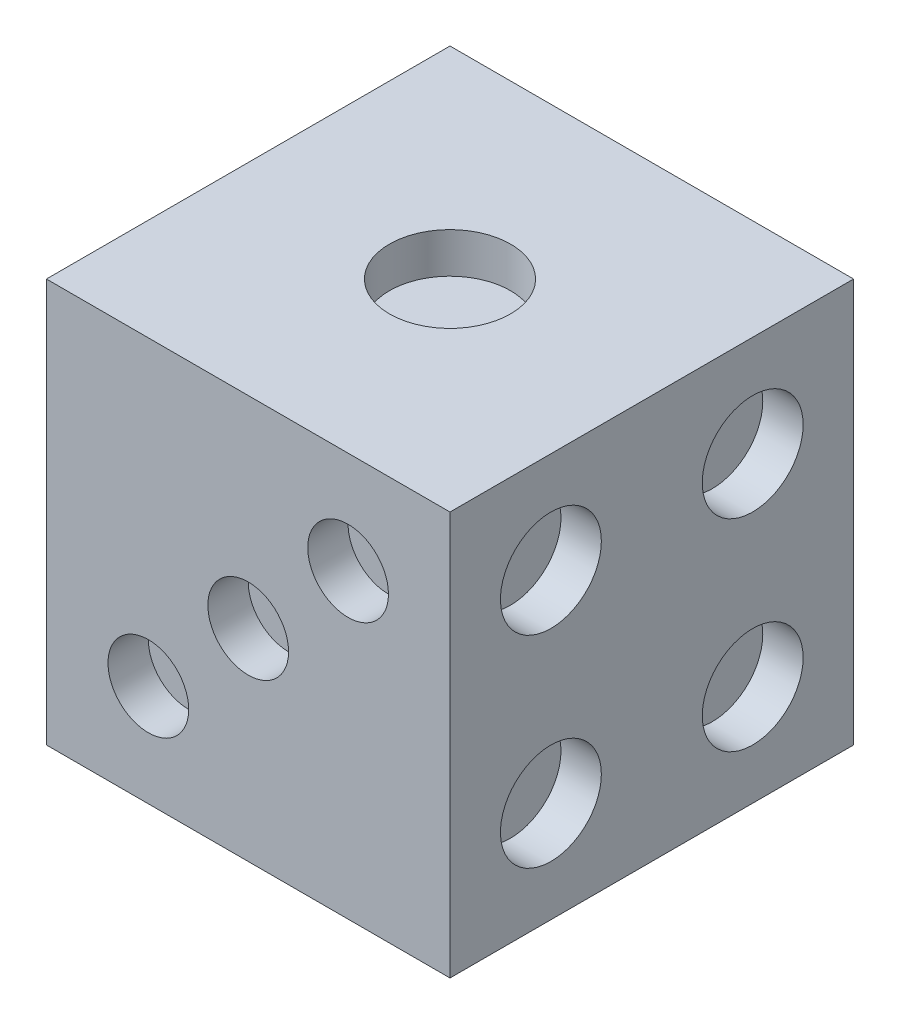
ISO-10303-21;
HEADER;
FILE_DESCRIPTION(('STEP AP214'),'2;1');
FILE_NAME('part.step','',(''),(''),'','','');
FILE_SCHEMA(('AUTOMOTIVE_DESIGN { 1 0 10303 214 1 1 1 1 }'));
ENDSEC;
DATA;
#1=APPLICATION_CONTEXT('core data for automotive mechanical design processes');
#2=APPLICATION_PROTOCOL_DEFINITION('international standard','automotive_design',2000,#1);
#3=PRODUCT_CONTEXT('',#1,'mechanical');
#4=PRODUCT('Part','Part','',(#3));
#5=PRODUCT_RELATED_PRODUCT_CATEGORY('part','',(#4));
#6=PRODUCT_DEFINITION_FORMATION('','',#4);
#7=PRODUCT_DEFINITION_CONTEXT('part definition',#1,'design');
#8=PRODUCT_DEFINITION('design','',#6,#7);
#9=PRODUCT_DEFINITION_SHAPE('','',#8);
#10=(LENGTH_UNIT() NAMED_UNIT(*) SI_UNIT(.MILLI.,.METRE.));
#11=(NAMED_UNIT(*) PLANE_ANGLE_UNIT() SI_UNIT($,.RADIAN.));
#12=(NAMED_UNIT(*) SI_UNIT($,.STERADIAN.) SOLID_ANGLE_UNIT());
#13=UNCERTAINTY_MEASURE_WITH_UNIT(LENGTH_MEASURE(1.E-05),#10,'distance_accuracy_value','');
#14=(GEOMETRIC_REPRESENTATION_CONTEXT(3) GLOBAL_UNCERTAINTY_ASSIGNED_CONTEXT((#13)) GLOBAL_UNIT_ASSIGNED_CONTEXT((#10,
#11,#12)) REPRESENTATION_CONTEXT('',''));
#15=CARTESIAN_POINT('',(0.,0.,0.));
#16=DIRECTION('',(0.,0.,1.));
#17=DIRECTION('',(1.,0.,0.));
#18=AXIS2_PLACEMENT_3D('',#15,#16,#17);
#19=CARTESIAN_POINT('',(50.,100.,50.));
#20=DIRECTION('',(0.,0.,1.));
#21=DIRECTION('',(1.,0.,0.));
#22=AXIS2_PLACEMENT_3D('',#19,#20,#21);
#23=PLANE('',#22);
#24=CARTESIAN_POINT('',(24.7487373415292,74.7487373415292,50.));
#25=DIRECTION('',(0.,0.,1.));
#26=DIRECTION('',(1.,0.,0.));
#27=AXIS2_PLACEMENT_3D('',#24,#25,#26);
#28=CIRCLE('',#27,10.);
#29=CARTESIAN_POINT('',(34.7487373415292,74.7487373415292,50.));
#30=VERTEX_POINT('',#29);
#31=EDGE_CURVE('E124',#30,#30,#28,.T.);
#32=ORIENTED_EDGE('',*,*,#31,.F.);
#33=EDGE_LOOP('',(#32));
#34=FACE_BOUND('',#33,.T.);
#35=CARTESIAN_POINT('',(0.,50.,50.));
#36=DIRECTION('',(0.,0.,1.));
#37=DIRECTION('',(1.,0.,0.));
#38=AXIS2_PLACEMENT_3D('',#35,#36,#37);
#39=CIRCLE('',#38,10.);
#40=CARTESIAN_POINT('',(10.,50.,50.));
#41=VERTEX_POINT('',#40);
#42=EDGE_CURVE('E128',#41,#41,#39,.T.);
#43=ORIENTED_EDGE('',*,*,#42,.F.);
#44=EDGE_LOOP('',(#43));
#45=FACE_BOUND('',#44,.T.);
#46=CARTESIAN_POINT('',(-24.7487373415292,25.2512626584708,50.));
#47=DIRECTION('',(0.,0.,1.));
#48=DIRECTION('',(1.,0.,0.));
#49=AXIS2_PLACEMENT_3D('',#46,#47,#48);
#50=CIRCLE('',#49,10.);
#51=CARTESIAN_POINT('',(-14.7487373415292,25.2512626584708,50.));
#52=VERTEX_POINT('',#51);
#53=EDGE_CURVE('E131',#52,#52,#50,.T.);
#54=ORIENTED_EDGE('',*,*,#53,.F.);
#55=EDGE_LOOP('',(#54));
#56=FACE_BOUND('',#55,.T.);
#57=DIRECTION('',(-1.,0.,0.));
#58=VECTOR('',#57,1.);
#59=CARTESIAN_POINT('',(50.,0.,50.));
#60=LINE('',#59,#58);
#61=CARTESIAN_POINT('',(50.,0.,50.));
#62=VERTEX_POINT('',#61);
#63=CARTESIAN_POINT('',(-50.,0.,50.));
#64=VERTEX_POINT('',#63);
#65=EDGE_CURVE('E103',#62,#64,#60,.T.);
#66=ORIENTED_EDGE('',*,*,#65,.F.);
#67=DIRECTION('',(0.,-1.,0.));
#68=VECTOR('',#67,1.);
#69=CARTESIAN_POINT('',(50.,100.,50.));
#70=LINE('',#69,#68);
#71=CARTESIAN_POINT('',(50.,100.,50.));
#72=VERTEX_POINT('',#71);
#73=EDGE_CURVE('E11',#72,#62,#70,.T.);
#74=ORIENTED_EDGE('',*,*,#73,.F.);
#75=DIRECTION('',(-1.,0.,0.));
#76=VECTOR('',#75,1.);
#77=CARTESIAN_POINT('',(50.,100.,50.));
#78=LINE('',#77,#76);
#79=CARTESIAN_POINT('',(-50.,100.,50.));
#80=VERTEX_POINT('',#79);
#81=EDGE_CURVE('E97',#72,#80,#78,.T.);
#82=ORIENTED_EDGE('',*,*,#81,.T.);
#83=DIRECTION('',(0.,-1.,0.));
#84=VECTOR('',#83,1.);
#85=CARTESIAN_POINT('',(-50.,100.,50.));
#86=LINE('',#85,#84);
#87=EDGE_CURVE('E40',#80,#64,#86,.T.);
#88=ORIENTED_EDGE('',*,*,#87,.T.);
#89=EDGE_LOOP('',(#66,#74,#82,#88));
#90=FACE_BOUND('',#89,.T.);
#91=ADVANCED_FACE('F37',(#34,#45,#56,#90),#23,.T.);
#92=CARTESIAN_POINT('',(50.,100.,50.));
#93=DIRECTION('',(-1.,0.,0.));
#94=DIRECTION('',(0.,0.,1.));
#95=AXIS2_PLACEMENT_3D('',#92,#93,#94);
#96=PLANE('',#95);
#97=CARTESIAN_POINT('',(50.,25.,25.));
#98=DIRECTION('',(1.,0.,0.));
#99=DIRECTION('',(0.,0.,-1.));
#100=AXIS2_PLACEMENT_3D('',#97,#98,#99);
#101=CIRCLE('',#100,12.5);
#102=CARTESIAN_POINT('',(50.,25.,12.5));
#103=VERTEX_POINT('',#102);
#104=EDGE_CURVE('E224',#103,#103,#101,.T.);
#105=ORIENTED_EDGE('',*,*,#104,.F.);
#106=EDGE_LOOP('',(#105));
#107=FACE_BOUND('',#106,.T.);
#108=CARTESIAN_POINT('',(50.,75.,25.));
#109=DIRECTION('',(1.,0.,0.));
#110=DIRECTION('',(0.,0.,-1.));
#111=AXIS2_PLACEMENT_3D('',#108,#109,#110);
#112=CIRCLE('',#111,12.5);
#113=CARTESIAN_POINT('',(50.,75.,12.5));
#114=VERTEX_POINT('',#113);
#115=EDGE_CURVE('E231',#114,#114,#112,.T.);
#116=ORIENTED_EDGE('',*,*,#115,.F.);
#117=EDGE_LOOP('',(#116));
#118=FACE_BOUND('',#117,.T.);
#119=CARTESIAN_POINT('',(50.,75.,-25.));
#120=DIRECTION('',(1.,0.,0.));
#121=DIRECTION('',(0.,0.,-1.));
#122=AXIS2_PLACEMENT_3D('',#119,#120,#121);
#123=CIRCLE('',#122,12.5);
#124=CARTESIAN_POINT('',(50.,75.,-37.5));
#125=VERTEX_POINT('',#124);
#126=EDGE_CURVE('E218',#125,#125,#123,.T.);
#127=ORIENTED_EDGE('',*,*,#126,.F.);
#128=EDGE_LOOP('',(#127));
#129=FACE_BOUND('',#128,.T.);
#130=CARTESIAN_POINT('',(50.,25.,-25.));
#131=DIRECTION('',(1.,0.,0.));
#132=DIRECTION('',(0.,0.,-1.));
#133=AXIS2_PLACEMENT_3D('',#130,#131,#132);
#134=CIRCLE('',#133,12.5);
#135=CARTESIAN_POINT('',(50.,25.,-37.5));
#136=VERTEX_POINT('',#135);
#137=EDGE_CURVE('E215',#136,#136,#134,.T.);
#138=ORIENTED_EDGE('',*,*,#137,.F.);
#139=EDGE_LOOP('',(#138));
#140=FACE_BOUND('',#139,.T.);
#141=DIRECTION('',(0.,0.,-1.));
#142=VECTOR('',#141,1.);
#143=CARTESIAN_POINT('',(50.,0.,50.));
#144=LINE('',#143,#142);
#145=CARTESIAN_POINT('',(50.,0.,-50.));
#146=VERTEX_POINT('',#145);
#147=EDGE_CURVE('E70',#62,#146,#144,.T.);
#148=ORIENTED_EDGE('',*,*,#147,.T.);
#149=DIRECTION('',(0.,-1.,0.));
#150=VECTOR('',#149,1.);
#151=CARTESIAN_POINT('',(50.,100.,-50.));
#152=LINE('',#151,#150);
#153=CARTESIAN_POINT('',(50.,100.,-50.));
#154=VERTEX_POINT('',#153);
#155=EDGE_CURVE('E46',#154,#146,#152,.T.);
#156=ORIENTED_EDGE('',*,*,#155,.F.);
#157=DIRECTION('',(0.,0.,-1.));
#158=VECTOR('',#157,1.);
#159=CARTESIAN_POINT('',(50.,100.,50.));
#160=LINE('',#159,#158);
#161=EDGE_CURVE('E87',#72,#154,#160,.T.);
#162=ORIENTED_EDGE('',*,*,#161,.F.);
#163=ORIENTED_EDGE('',*,*,#73,.T.);
#164=EDGE_LOOP('',(#148,#156,#162,#163));
#165=FACE_BOUND('',#164,.T.);
#166=ADVANCED_FACE('F114',(#107,#118,#129,#140,#165),#96,.F.);
#167=CARTESIAN_POINT('',(50.,100.,-50.));
#168=DIRECTION('',(0.,0.,1.));
#169=DIRECTION('',(1.,0.,0.));
#170=AXIS2_PLACEMENT_3D('',#167,#168,#169);
#171=PLANE('',#170);
#172=CARTESIAN_POINT('',(27.5,22.5,-50.));
#173=DIRECTION('',(0.,0.,-1.));
#174=DIRECTION('',(-1.,0.,0.));
#175=AXIS2_PLACEMENT_3D('',#172,#173,#174);
#176=CIRCLE('',#175,10.);
#177=CARTESIAN_POINT('',(17.5,22.5,-50.));
#178=VERTEX_POINT('',#177);
#179=EDGE_CURVE('E245',#178,#178,#176,.T.);
#180=ORIENTED_EDGE('',*,*,#179,.F.);
#181=EDGE_LOOP('',(#180));
#182=FACE_BOUND('',#181,.T.);
#183=CARTESIAN_POINT('',(-27.5,22.5,-50.));
#184=DIRECTION('',(0.,0.,-1.));
#185=DIRECTION('',(-1.,0.,0.));
#186=AXIS2_PLACEMENT_3D('',#183,#184,#185);
#187=CIRCLE('',#186,10.);
#188=CARTESIAN_POINT('',(-37.5,22.5,-50.));
#189=VERTEX_POINT('',#188);
#190=EDGE_CURVE('E252',#189,#189,#187,.T.);
#191=ORIENTED_EDGE('',*,*,#190,.F.);
#192=EDGE_LOOP('',(#191));
#193=FACE_BOUND('',#192,.T.);
#194=CARTESIAN_POINT('',(-27.5,77.5,-50.));
#195=DIRECTION('',(0.,0.,-1.));
#196=DIRECTION('',(-1.,0.,0.));
#197=AXIS2_PLACEMENT_3D('',#194,#195,#196);
#198=CIRCLE('',#197,10.);
#199=CARTESIAN_POINT('',(-37.5,77.5,-50.));
#200=VERTEX_POINT('',#199);
#201=EDGE_CURVE('E258',#200,#200,#198,.T.);
#202=ORIENTED_EDGE('',*,*,#201,.F.);
#203=EDGE_LOOP('',(#202));
#204=FACE_BOUND('',#203,.T.);
#205=CARTESIAN_POINT('',(27.5,77.5,-50.));
#206=DIRECTION('',(0.,0.,-1.));
#207=DIRECTION('',(-1.,0.,0.));
#208=AXIS2_PLACEMENT_3D('',#205,#206,#207);
#209=CIRCLE('',#208,10.);
#210=CARTESIAN_POINT('',(17.5,77.5,-50.));
#211=VERTEX_POINT('',#210);
#212=EDGE_CURVE('E264',#211,#211,#209,.T.);
#213=ORIENTED_EDGE('',*,*,#212,.F.);
#214=EDGE_LOOP('',(#213));
#215=FACE_BOUND('',#214,.T.);
#216=CARTESIAN_POINT('',(0.,50.,-50.));
#217=DIRECTION('',(0.,0.,-1.));
#218=DIRECTION('',(-1.,0.,0.));
#219=AXIS2_PLACEMENT_3D('',#216,#217,#218);
#220=CIRCLE('',#219,10.);
#221=CARTESIAN_POINT('',(-10.,50.,-50.));
#222=VERTEX_POINT('',#221);
#223=EDGE_CURVE('E239',#222,#222,#220,.T.);
#224=ORIENTED_EDGE('',*,*,#223,.F.);
#225=EDGE_LOOP('',(#224));
#226=FACE_BOUND('',#225,.T.);
#227=DIRECTION('',(-1.,0.,0.));
#228=VECTOR('',#227,1.);
#229=CARTESIAN_POINT('',(50.,0.,-50.));
#230=LINE('',#229,#228);
#231=CARTESIAN_POINT('',(-50.,0.,-50.));
#232=VERTEX_POINT('',#231);
#233=EDGE_CURVE('E94',#146,#232,#230,.T.);
#234=ORIENTED_EDGE('',*,*,#233,.T.);
#235=DIRECTION('',(0.,-1.,0.));
#236=VECTOR('',#235,1.);
#237=CARTESIAN_POINT('',(-50.,100.,-50.));
#238=LINE('',#237,#236);
#239=CARTESIAN_POINT('',(-50.,100.,-50.));
#240=VERTEX_POINT('',#239);
#241=EDGE_CURVE('E91',#240,#232,#238,.T.);
#242=ORIENTED_EDGE('',*,*,#241,.F.);
#243=DIRECTION('',(-1.,0.,0.));
#244=VECTOR('',#243,1.);
#245=CARTESIAN_POINT('',(50.,100.,-50.));
#246=LINE('',#245,#244);
#247=EDGE_CURVE('E82',#154,#240,#246,.T.);
#248=ORIENTED_EDGE('',*,*,#247,.F.);
#249=ORIENTED_EDGE('',*,*,#155,.T.);
#250=EDGE_LOOP('',(#234,#242,#248,#249));
#251=FACE_BOUND('',#250,.T.);
#252=ADVANCED_FACE('F92',(#182,#193,#204,#215,#226,#251),#171,.F.);
#253=CARTESIAN_POINT('',(-50.,100.,50.));
#254=DIRECTION('',(-1.,0.,0.));
#255=DIRECTION('',(0.,0.,1.));
#256=AXIS2_PLACEMENT_3D('',#253,#254,#255);
#257=PLANE('',#256);
#258=CARTESIAN_POINT('',(-50.,33.0294372515229,16.9705627484771));
#259=DIRECTION('',(-1.,0.,0.));
#260=DIRECTION('',(0.,0.,1.));
#261=AXIS2_PLACEMENT_3D('',#258,#259,#260);
#262=CIRCLE('',#261,13.);
#263=CARTESIAN_POINT('',(-50.,33.0294372515229,29.9705627484771));
#264=VERTEX_POINT('',#263);
#265=EDGE_CURVE('E204',#264,#264,#262,.T.);
#266=ORIENTED_EDGE('',*,*,#265,.F.);
#267=EDGE_LOOP('',(#266));
#268=FACE_BOUND('',#267,.T.);
#269=CARTESIAN_POINT('',(-50.,66.9705627484771,-16.9705627484771));
#270=DIRECTION('',(-1.,0.,0.));
#271=DIRECTION('',(0.,0.,1.));
#272=AXIS2_PLACEMENT_3D('',#269,#270,#271);
#273=CIRCLE('',#272,13.);
#274=CARTESIAN_POINT('',(-50.,66.9705627484771,-3.97056274847713));
#275=VERTEX_POINT('',#274);
#276=EDGE_CURVE('E207',#275,#275,#273,.T.);
#277=ORIENTED_EDGE('',*,*,#276,.F.);
#278=EDGE_LOOP('',(#277));
#279=FACE_BOUND('',#278,.T.);
#280=DIRECTION('',(0.,0.,-1.));
#281=VECTOR('',#280,1.);
#282=CARTESIAN_POINT('',(-50.,0.,50.));
#283=LINE('',#282,#281);
#284=EDGE_CURVE('E106',#64,#232,#283,.T.);
#285=ORIENTED_EDGE('',*,*,#284,.F.);
#286=ORIENTED_EDGE('',*,*,#87,.F.);
#287=DIRECTION('',(0.,0.,-1.));
#288=VECTOR('',#287,1.);
#289=CARTESIAN_POINT('',(-50.,100.,50.));
#290=LINE('',#289,#288);
#291=EDGE_CURVE('E86',#80,#240,#290,.T.);
#292=ORIENTED_EDGE('',*,*,#291,.T.);
#293=ORIENTED_EDGE('',*,*,#241,.T.);
#294=EDGE_LOOP('',(#285,#286,#292,#293));
#295=FACE_BOUND('',#294,.T.);
#296=ADVANCED_FACE('F96',(#268,#279,#295),#257,.T.);
#297=CARTESIAN_POINT('',(0.,100.,0.));
#298=DIRECTION('',(0.,-1.,0.));
#299=DIRECTION('',(0.,0.,-1.));
#300=AXIS2_PLACEMENT_3D('',#297,#298,#299);
#301=PLANE('',#300);
#302=CARTESIAN_POINT('',(0.,100.,0.));
#303=DIRECTION('',(0.,1.,0.));
#304=DIRECTION('',(0.,0.,1.));
#305=AXIS2_PLACEMENT_3D('',#302,#303,#304);
#306=CIRCLE('',#305,15.);
#307=CARTESIAN_POINT('',(0.,100.,15.));
#308=VERTEX_POINT('',#307);
#309=EDGE_CURVE('E144',#308,#308,#306,.T.);
#310=ORIENTED_EDGE('',*,*,#309,.F.);
#311=EDGE_LOOP('',(#310));
#312=FACE_BOUND('',#311,.T.);
#313=ORIENTED_EDGE('',*,*,#81,.F.);
#314=ORIENTED_EDGE('',*,*,#161,.T.);
#315=ORIENTED_EDGE('',*,*,#247,.T.);
#316=ORIENTED_EDGE('',*,*,#291,.F.);
#317=EDGE_LOOP('',(#313,#314,#315,#316));
#318=FACE_BOUND('',#317,.T.);
#319=ADVANCED_FACE('F85',(#312,#318),#301,.F.);
#320=CARTESIAN_POINT('',(0.,0.,0.));
#321=DIRECTION('',(0.,-1.,0.));
#322=DIRECTION('',(0.,0.,-1.));
#323=AXIS2_PLACEMENT_3D('',#320,#321,#322);
#324=PLANE('',#323);
#325=CARTESIAN_POINT('',(-16.67,0.,0.));
#326=DIRECTION('',(0.,-1.,0.));
#327=DIRECTION('',(0.,0.,-1.));
#328=AXIS2_PLACEMENT_3D('',#325,#326,#327);
#329=CIRCLE('',#328,10.);
#330=CARTESIAN_POINT('',(-16.67,0.,-10.));
#331=VERTEX_POINT('',#330);
#332=EDGE_CURVE('E294',#331,#331,#329,.T.);
#333=ORIENTED_EDGE('',*,*,#332,.F.);
#334=EDGE_LOOP('',(#333));
#335=FACE_BOUND('',#334,.T.);
#336=CARTESIAN_POINT('',(-16.67,0.,-25.));
#337=DIRECTION('',(0.,-1.,0.));
#338=DIRECTION('',(0.,0.,-1.));
#339=AXIS2_PLACEMENT_3D('',#336,#337,#338);
#340=CIRCLE('',#339,10.);
#341=CARTESIAN_POINT('',(-16.67,0.,-35.));
#342=VERTEX_POINT('',#341);
#343=EDGE_CURVE('E288',#342,#342,#340,.T.);
#344=ORIENTED_EDGE('',*,*,#343,.F.);
#345=EDGE_LOOP('',(#344));
#346=FACE_BOUND('',#345,.T.);
#347=CARTESIAN_POINT('',(16.67,0.,-25.));
#348=DIRECTION('',(0.,-1.,0.));
#349=DIRECTION('',(0.,0.,-1.));
#350=AXIS2_PLACEMENT_3D('',#347,#348,#349);
#351=CIRCLE('',#350,10.);
#352=CARTESIAN_POINT('',(16.67,0.,-35.));
#353=VERTEX_POINT('',#352);
#354=EDGE_CURVE('E282',#353,#353,#351,.T.);
#355=ORIENTED_EDGE('',*,*,#354,.F.);
#356=EDGE_LOOP('',(#355));
#357=FACE_BOUND('',#356,.T.);
#358=CARTESIAN_POINT('',(16.67,0.,25.));
#359=DIRECTION('',(0.,-1.,0.));
#360=DIRECTION('',(0.,0.,-1.));
#361=AXIS2_PLACEMENT_3D('',#358,#359,#360);
#362=CIRCLE('',#361,10.);
#363=CARTESIAN_POINT('',(16.67,0.,15.));
#364=VERTEX_POINT('',#363);
#365=EDGE_CURVE('E275',#364,#364,#362,.T.);
#366=ORIENTED_EDGE('',*,*,#365,.F.);
#367=EDGE_LOOP('',(#366));
#368=FACE_BOUND('',#367,.T.);
#369=CARTESIAN_POINT('',(-16.67,0.,25.));
#370=DIRECTION('',(0.,-1.,0.));
#371=DIRECTION('',(0.,0.,-1.));
#372=AXIS2_PLACEMENT_3D('',#369,#370,#371);
#373=CIRCLE('',#372,10.);
#374=CARTESIAN_POINT('',(-16.67,0.,15.));
#375=VERTEX_POINT('',#374);
#376=EDGE_CURVE('E299',#375,#375,#373,.T.);
#377=ORIENTED_EDGE('',*,*,#376,.F.);
#378=EDGE_LOOP('',(#377));
#379=FACE_BOUND('',#378,.T.);
#380=CARTESIAN_POINT('',(16.67,0.,0.));
#381=DIRECTION('',(0.,-1.,0.));
#382=DIRECTION('',(0.,0.,-1.));
#383=AXIS2_PLACEMENT_3D('',#380,#381,#382);
#384=CIRCLE('',#383,10.);
#385=CARTESIAN_POINT('',(16.67,0.,-10.));
#386=VERTEX_POINT('',#385);
#387=EDGE_CURVE('E269',#386,#386,#384,.T.);
#388=ORIENTED_EDGE('',*,*,#387,.F.);
#389=EDGE_LOOP('',(#388));
#390=FACE_BOUND('',#389,.T.);
#391=ORIENTED_EDGE('',*,*,#65,.T.);
#392=ORIENTED_EDGE('',*,*,#284,.T.);
#393=ORIENTED_EDGE('',*,*,#233,.F.);
#394=ORIENTED_EDGE('',*,*,#147,.F.);
#395=EDGE_LOOP('',(#391,#392,#393,#394));
#396=FACE_BOUND('',#395,.T.);
#397=ADVANCED_FACE('F112',(#335,#346,#357,#368,#379,#390,#396),#324,.T.);
#398=CARTESIAN_POINT('',(0.,90.,0.));
#399=DIRECTION('',(0.,1.,0.));
#400=DIRECTION('',(0.,0.,1.));
#401=AXIS2_PLACEMENT_3D('',#398,#399,#400);
#402=CYLINDRICAL_SURFACE('',#401,15.);
#403=CARTESIAN_POINT('',(0.,90.,0.));
#404=DIRECTION('',(0.,1.,0.));
#405=DIRECTION('',(0.,0.,1.));
#406=AXIS2_PLACEMENT_3D('',#403,#404,#405);
#407=CIRCLE('',#406,15.);
#408=CARTESIAN_POINT('',(0.,90.,15.));
#409=VERTEX_POINT('',#408);
#410=EDGE_CURVE('E107',#409,#409,#407,.T.);
#411=ORIENTED_EDGE('',*,*,#410,.F.);
#412=EDGE_LOOP('',(#411));
#413=FACE_BOUND('',#412,.T.);
#414=ORIENTED_EDGE('',*,*,#309,.T.);
#415=EDGE_LOOP('',(#414));
#416=FACE_BOUND('',#415,.T.);
#417=ADVANCED_FACE('F184',(#413,#416),#402,.F.);
#418=CARTESIAN_POINT('',(0.,90.,0.));
#419=DIRECTION('',(0.,1.,0.));
#420=DIRECTION('',(0.,0.,1.));
#421=AXIS2_PLACEMENT_3D('',#418,#419,#420);
#422=PLANE('',#421);
#423=ORIENTED_EDGE('',*,*,#410,.T.);
#424=EDGE_LOOP('',(#423));
#425=FACE_BOUND('',#424,.T.);
#426=ADVANCED_FACE('F179',(#425),#422,.T.);
#427=CARTESIAN_POINT('',(-24.7487373415292,25.2512626584708,40.));
#428=DIRECTION('',(0.,0.,1.));
#429=DIRECTION('',(1.,0.,0.));
#430=AXIS2_PLACEMENT_3D('',#427,#428,#429);
#431=CYLINDRICAL_SURFACE('',#430,10.);
#432=CARTESIAN_POINT('',(-24.7487373415292,25.2512626584708,40.));
#433=DIRECTION('',(0.,0.,1.));
#434=DIRECTION('',(1.,0.,0.));
#435=AXIS2_PLACEMENT_3D('',#432,#433,#434);
#436=CIRCLE('',#435,10.);
#437=CARTESIAN_POINT('',(-14.7487373415292,25.2512626584708,40.));
#438=VERTEX_POINT('',#437);
#439=EDGE_CURVE('E134',#438,#438,#436,.T.);
#440=ORIENTED_EDGE('',*,*,#439,.F.);
#441=EDGE_LOOP('',(#440));
#442=FACE_BOUND('',#441,.T.);
#443=ORIENTED_EDGE('',*,*,#53,.T.);
#444=EDGE_LOOP('',(#443));
#445=FACE_BOUND('',#444,.T.);
#446=ADVANCED_FACE('F171',(#442,#445),#431,.F.);
#447=CARTESIAN_POINT('',(-24.7487373415292,25.2512626584708,40.));
#448=DIRECTION('',(0.,0.,1.));
#449=DIRECTION('',(1.,0.,0.));
#450=AXIS2_PLACEMENT_3D('',#447,#448,#449);
#451=PLANE('',#450);
#452=ORIENTED_EDGE('',*,*,#439,.T.);
#453=EDGE_LOOP('',(#452));
#454=FACE_BOUND('',#453,.T.);
#455=ADVANCED_FACE('F161',(#454),#451,.T.);
#456=CARTESIAN_POINT('',(0.,50.,40.));
#457=DIRECTION('',(0.,0.,1.));
#458=DIRECTION('',(1.,0.,0.));
#459=AXIS2_PLACEMENT_3D('',#456,#457,#458);
#460=CYLINDRICAL_SURFACE('',#459,10.);
#461=CARTESIAN_POINT('',(0.,50.,40.));
#462=DIRECTION('',(0.,0.,1.));
#463=DIRECTION('',(1.,0.,0.));
#464=AXIS2_PLACEMENT_3D('',#461,#462,#463);
#465=CIRCLE('',#464,10.);
#466=CARTESIAN_POINT('',(10.,50.,40.));
#467=VERTEX_POINT('',#466);
#468=EDGE_CURVE('E133',#467,#467,#465,.T.);
#469=ORIENTED_EDGE('',*,*,#468,.F.);
#470=EDGE_LOOP('',(#469));
#471=FACE_BOUND('',#470,.T.);
#472=ORIENTED_EDGE('',*,*,#42,.T.);
#473=EDGE_LOOP('',(#472));
#474=FACE_BOUND('',#473,.T.);
#475=ADVANCED_FACE('F158',(#471,#474),#460,.F.);
#476=CARTESIAN_POINT('',(0.,50.,40.));
#477=DIRECTION('',(0.,0.,1.));
#478=DIRECTION('',(1.,0.,0.));
#479=AXIS2_PLACEMENT_3D('',#476,#477,#478);
#480=PLANE('',#479);
#481=ORIENTED_EDGE('',*,*,#468,.T.);
#482=EDGE_LOOP('',(#481));
#483=FACE_BOUND('',#482,.T.);
#484=ADVANCED_FACE('F160',(#483),#480,.T.);
#485=CARTESIAN_POINT('',(24.7487373415292,74.7487373415292,40.));
#486=DIRECTION('',(0.,0.,1.));
#487=DIRECTION('',(1.,0.,0.));
#488=AXIS2_PLACEMENT_3D('',#485,#486,#487);
#489=CYLINDRICAL_SURFACE('',#488,10.);
#490=CARTESIAN_POINT('',(24.7487373415292,74.7487373415292,40.));
#491=DIRECTION('',(0.,0.,1.));
#492=DIRECTION('',(1.,0.,0.));
#493=AXIS2_PLACEMENT_3D('',#490,#491,#492);
#494=CIRCLE('',#493,10.);
#495=CARTESIAN_POINT('',(34.7487373415292,74.7487373415292,40.));
#496=VERTEX_POINT('',#495);
#497=EDGE_CURVE('E146',#496,#496,#494,.T.);
#498=ORIENTED_EDGE('',*,*,#497,.F.);
#499=EDGE_LOOP('',(#498));
#500=FACE_BOUND('',#499,.T.);
#501=ORIENTED_EDGE('',*,*,#31,.T.);
#502=EDGE_LOOP('',(#501));
#503=FACE_BOUND('',#502,.T.);
#504=ADVANCED_FACE('F168',(#500,#503),#489,.F.);
#505=CARTESIAN_POINT('',(24.7487373415292,74.7487373415292,40.));
#506=DIRECTION('',(0.,0.,1.));
#507=DIRECTION('',(1.,0.,0.));
#508=AXIS2_PLACEMENT_3D('',#505,#506,#507);
#509=PLANE('',#508);
#510=ORIENTED_EDGE('',*,*,#497,.T.);
#511=EDGE_LOOP('',(#510));
#512=FACE_BOUND('',#511,.T.);
#513=ADVANCED_FACE('F413',(#512),#509,.T.);
#514=CARTESIAN_POINT('',(-40.,66.9705627484771,-16.9705627484771));
#515=DIRECTION('',(-1.,0.,0.));
#516=DIRECTION('',(0.,0.,1.));
#517=AXIS2_PLACEMENT_3D('',#514,#515,#516);
#518=CYLINDRICAL_SURFACE('',#517,13.);
#519=CARTESIAN_POINT('',(-40.,66.9705627484771,-16.9705627484771));
#520=DIRECTION('',(-1.,0.,0.));
#521=DIRECTION('',(0.,0.,1.));
#522=AXIS2_PLACEMENT_3D('',#519,#520,#521);
#523=CIRCLE('',#522,13.);
#524=CARTESIAN_POINT('',(-40.,66.9705627484771,-3.97056274847713));
#525=VERTEX_POINT('',#524);
#526=EDGE_CURVE('E155',#525,#525,#523,.T.);
#527=ORIENTED_EDGE('',*,*,#526,.F.);
#528=EDGE_LOOP('',(#527));
#529=FACE_BOUND('',#528,.T.);
#530=ORIENTED_EDGE('',*,*,#276,.T.);
#531=EDGE_LOOP('',(#530));
#532=FACE_BOUND('',#531,.T.);
#533=ADVANCED_FACE('F410',(#529,#532),#518,.F.);
#534=CARTESIAN_POINT('',(-40.,66.9705627484771,-16.9705627484771));
#535=DIRECTION('',(-1.,0.,0.));
#536=DIRECTION('',(0.,0.,1.));
#537=AXIS2_PLACEMENT_3D('',#534,#535,#536);
#538=PLANE('',#537);
#539=ORIENTED_EDGE('',*,*,#526,.T.);
#540=EDGE_LOOP('',(#539));
#541=FACE_BOUND('',#540,.T.);
#542=ADVANCED_FACE('F408',(#541),#538,.T.);
#543=CARTESIAN_POINT('',(-40.,33.0294372515229,16.9705627484771));
#544=DIRECTION('',(-1.,0.,0.));
#545=DIRECTION('',(0.,0.,1.));
#546=AXIS2_PLACEMENT_3D('',#543,#544,#545);
#547=CYLINDRICAL_SURFACE('',#546,13.);
#548=CARTESIAN_POINT('',(-40.,33.0294372515229,16.9705627484771));
#549=DIRECTION('',(-1.,0.,0.));
#550=DIRECTION('',(0.,0.,1.));
#551=AXIS2_PLACEMENT_3D('',#548,#549,#550);
#552=CIRCLE('',#551,13.);
#553=CARTESIAN_POINT('',(-40.,33.0294372515229,29.9705627484771));
#554=VERTEX_POINT('',#553);
#555=EDGE_CURVE('E139',#554,#554,#552,.T.);
#556=ORIENTED_EDGE('',*,*,#555,.F.);
#557=EDGE_LOOP('',(#556));
#558=FACE_BOUND('',#557,.T.);
#559=ORIENTED_EDGE('',*,*,#265,.T.);
#560=EDGE_LOOP('',(#559));
#561=FACE_BOUND('',#560,.T.);
#562=ADVANCED_FACE('F404',(#558,#561),#547,.F.);
#563=CARTESIAN_POINT('',(-40.,33.0294372515229,16.9705627484771));
#564=DIRECTION('',(-1.,0.,0.));
#565=DIRECTION('',(0.,0.,1.));
#566=AXIS2_PLACEMENT_3D('',#563,#564,#565);
#567=PLANE('',#566);
#568=ORIENTED_EDGE('',*,*,#555,.T.);
#569=EDGE_LOOP('',(#568));
#570=FACE_BOUND('',#569,.T.);
#571=ADVANCED_FACE('F400',(#570),#567,.T.);
#572=CARTESIAN_POINT('',(40.,25.,-25.));
#573=DIRECTION('',(1.,0.,0.));
#574=DIRECTION('',(0.,0.,-1.));
#575=AXIS2_PLACEMENT_3D('',#572,#573,#574);
#576=CYLINDRICAL_SURFACE('',#575,12.5);
#577=CARTESIAN_POINT('',(40.,25.,-25.));
#578=DIRECTION('',(1.,0.,0.));
#579=DIRECTION('',(0.,0.,-1.));
#580=AXIS2_PLACEMENT_3D('',#577,#578,#579);
#581=CIRCLE('',#580,12.5);
#582=CARTESIAN_POINT('',(40.,25.,-37.5));
#583=VERTEX_POINT('',#582);
#584=EDGE_CURVE('E211',#583,#583,#581,.T.);
#585=ORIENTED_EDGE('',*,*,#584,.F.);
#586=EDGE_LOOP('',(#585));
#587=FACE_BOUND('',#586,.T.);
#588=ORIENTED_EDGE('',*,*,#137,.T.);
#589=EDGE_LOOP('',(#588));
#590=FACE_BOUND('',#589,.T.);
#591=ADVANCED_FACE('F396',(#587,#590),#576,.F.);
#592=CARTESIAN_POINT('',(40.,25.,-25.));
#593=DIRECTION('',(1.,0.,0.));
#594=DIRECTION('',(0.,0.,-1.));
#595=AXIS2_PLACEMENT_3D('',#592,#593,#594);
#596=PLANE('',#595);
#597=ORIENTED_EDGE('',*,*,#584,.T.);
#598=EDGE_LOOP('',(#597));
#599=FACE_BOUND('',#598,.T.);
#600=ADVANCED_FACE('F374',(#599),#596,.T.);
#601=CARTESIAN_POINT('',(40.,75.,-25.));
#602=DIRECTION('',(1.,0.,0.));
#603=DIRECTION('',(0.,0.,-1.));
#604=AXIS2_PLACEMENT_3D('',#601,#602,#603);
#605=CYLINDRICAL_SURFACE('',#604,12.5);
#606=CARTESIAN_POINT('',(40.,75.,-25.));
#607=DIRECTION('',(1.,0.,0.));
#608=DIRECTION('',(0.,0.,-1.));
#609=AXIS2_PLACEMENT_3D('',#606,#607,#608);
#610=CIRCLE('',#609,12.5);
#611=CARTESIAN_POINT('',(40.,75.,-37.5));
#612=VERTEX_POINT('',#611);
#613=EDGE_CURVE('E234',#612,#612,#610,.T.);
#614=ORIENTED_EDGE('',*,*,#613,.F.);
#615=EDGE_LOOP('',(#614));
#616=FACE_BOUND('',#615,.T.);
#617=ORIENTED_EDGE('',*,*,#126,.T.);
#618=EDGE_LOOP('',(#617));
#619=FACE_BOUND('',#618,.T.);
#620=ADVANCED_FACE('F370',(#616,#619),#605,.F.);
#621=CARTESIAN_POINT('',(40.,75.,-25.));
#622=DIRECTION('',(1.,0.,0.));
#623=DIRECTION('',(0.,0.,-1.));
#624=AXIS2_PLACEMENT_3D('',#621,#622,#623);
#625=PLANE('',#624);
#626=ORIENTED_EDGE('',*,*,#613,.T.);
#627=EDGE_LOOP('',(#626));
#628=FACE_BOUND('',#627,.T.);
#629=ADVANCED_FACE('F373',(#628),#625,.T.);
#630=CARTESIAN_POINT('',(40.,75.,25.));
#631=DIRECTION('',(1.,0.,0.));
#632=DIRECTION('',(0.,0.,-1.));
#633=AXIS2_PLACEMENT_3D('',#630,#631,#632);
#634=CYLINDRICAL_SURFACE('',#633,12.5);
#635=CARTESIAN_POINT('',(40.,75.,25.));
#636=DIRECTION('',(1.,0.,0.));
#637=DIRECTION('',(0.,0.,-1.));
#638=AXIS2_PLACEMENT_3D('',#635,#636,#637);
#639=CIRCLE('',#638,12.5);
#640=CARTESIAN_POINT('',(40.,75.,12.5));
#641=VERTEX_POINT('',#640);
#642=EDGE_CURVE('E228',#641,#641,#639,.T.);
#643=ORIENTED_EDGE('',*,*,#642,.F.);
#644=EDGE_LOOP('',(#643));
#645=FACE_BOUND('',#644,.T.);
#646=ORIENTED_EDGE('',*,*,#115,.T.);
#647=EDGE_LOOP('',(#646));
#648=FACE_BOUND('',#647,.T.);
#649=ADVANCED_FACE('F378',(#645,#648),#634,.F.);
#650=CARTESIAN_POINT('',(40.,75.,25.));
#651=DIRECTION('',(1.,0.,0.));
#652=DIRECTION('',(0.,0.,-1.));
#653=AXIS2_PLACEMENT_3D('',#650,#651,#652);
#654=PLANE('',#653);
#655=ORIENTED_EDGE('',*,*,#642,.T.);
#656=EDGE_LOOP('',(#655));
#657=FACE_BOUND('',#656,.T.);
#658=ADVANCED_FACE('F382',(#657),#654,.T.);
#659=CARTESIAN_POINT('',(40.,25.,25.));
#660=DIRECTION('',(1.,0.,0.));
#661=DIRECTION('',(0.,0.,-1.));
#662=AXIS2_PLACEMENT_3D('',#659,#660,#661);
#663=CYLINDRICAL_SURFACE('',#662,12.5);
#664=CARTESIAN_POINT('',(40.,25.,25.));
#665=DIRECTION('',(1.,0.,0.));
#666=DIRECTION('',(0.,0.,-1.));
#667=AXIS2_PLACEMENT_3D('',#664,#665,#666);
#668=CIRCLE('',#667,12.5);
#669=CARTESIAN_POINT('',(40.,25.,12.5));
#670=VERTEX_POINT('',#669);
#671=EDGE_CURVE('E221',#670,#670,#668,.T.);
#672=ORIENTED_EDGE('',*,*,#671,.F.);
#673=EDGE_LOOP('',(#672));
#674=FACE_BOUND('',#673,.T.);
#675=ORIENTED_EDGE('',*,*,#104,.T.);
#676=EDGE_LOOP('',(#675));
#677=FACE_BOUND('',#676,.T.);
#678=ADVANCED_FACE('F386',(#674,#677),#663,.F.);
#679=CARTESIAN_POINT('',(40.,25.,25.));
#680=DIRECTION('',(1.,0.,0.));
#681=DIRECTION('',(0.,0.,-1.));
#682=AXIS2_PLACEMENT_3D('',#679,#680,#681);
#683=PLANE('',#682);
#684=ORIENTED_EDGE('',*,*,#671,.T.);
#685=EDGE_LOOP('',(#684));
#686=FACE_BOUND('',#685,.T.);
#687=ADVANCED_FACE('F368',(#686),#683,.T.);
#688=CARTESIAN_POINT('',(0.,50.,-40.));
#689=DIRECTION('',(0.,0.,-1.));
#690=DIRECTION('',(-1.,0.,0.));
#691=AXIS2_PLACEMENT_3D('',#688,#689,#690);
#692=CYLINDRICAL_SURFACE('',#691,10.);
#693=CARTESIAN_POINT('',(0.,50.,-40.));
#694=DIRECTION('',(0.,0.,-1.));
#695=DIRECTION('',(-1.,0.,0.));
#696=AXIS2_PLACEMENT_3D('',#693,#694,#695);
#697=CIRCLE('',#696,10.);
#698=CARTESIAN_POINT('',(-10.,50.,-40.));
#699=VERTEX_POINT('',#698);
#700=EDGE_CURVE('E225',#699,#699,#697,.T.);
#701=ORIENTED_EDGE('',*,*,#700,.F.);
#702=EDGE_LOOP('',(#701));
#703=FACE_BOUND('',#702,.T.);
#704=ORIENTED_EDGE('',*,*,#223,.T.);
#705=EDGE_LOOP('',(#704));
#706=FACE_BOUND('',#705,.T.);
#707=ADVANCED_FACE('F364',(#703,#706),#692,.F.);
#708=CARTESIAN_POINT('',(0.,50.,-40.));
#709=DIRECTION('',(0.,0.,-1.));
#710=DIRECTION('',(-1.,0.,0.));
#711=AXIS2_PLACEMENT_3D('',#708,#709,#710);
#712=PLANE('',#711);
#713=ORIENTED_EDGE('',*,*,#700,.T.);
#714=EDGE_LOOP('',(#713));
#715=FACE_BOUND('',#714,.T.);
#716=ADVANCED_FACE('F342',(#715),#712,.T.);
#717=CARTESIAN_POINT('',(27.5,77.5,-40.));
#718=DIRECTION('',(0.,0.,-1.));
#719=DIRECTION('',(-1.,0.,0.));
#720=AXIS2_PLACEMENT_3D('',#717,#718,#719);
#721=CYLINDRICAL_SURFACE('',#720,10.);
#722=CARTESIAN_POINT('',(27.5,77.5,-40.));
#723=DIRECTION('',(0.,0.,-1.));
#724=DIRECTION('',(-1.,0.,0.));
#725=AXIS2_PLACEMENT_3D('',#722,#723,#724);
#726=CIRCLE('',#725,10.);
#727=CARTESIAN_POINT('',(17.5,77.5,-40.));
#728=VERTEX_POINT('',#727);
#729=EDGE_CURVE('E242',#728,#728,#726,.T.);
#730=ORIENTED_EDGE('',*,*,#729,.F.);
#731=EDGE_LOOP('',(#730));
#732=FACE_BOUND('',#731,.T.);
#733=ORIENTED_EDGE('',*,*,#212,.T.);
#734=EDGE_LOOP('',(#733));
#735=FACE_BOUND('',#734,.T.);
#736=ADVANCED_FACE('F338',(#732,#735),#721,.F.);
#737=CARTESIAN_POINT('',(27.5,77.5,-40.));
#738=DIRECTION('',(0.,0.,-1.));
#739=DIRECTION('',(-1.,0.,0.));
#740=AXIS2_PLACEMENT_3D('',#737,#738,#739);
#741=PLANE('',#740);
#742=ORIENTED_EDGE('',*,*,#729,.T.);
#743=EDGE_LOOP('',(#742));
#744=FACE_BOUND('',#743,.T.);
#745=ADVANCED_FACE('F334',(#744),#741,.T.);
#746=CARTESIAN_POINT('',(-27.5,77.5,-40.));
#747=DIRECTION('',(0.,0.,-1.));
#748=DIRECTION('',(-1.,0.,0.));
#749=AXIS2_PLACEMENT_3D('',#746,#747,#748);
#750=CYLINDRICAL_SURFACE('',#749,10.);
#751=CARTESIAN_POINT('',(-27.5,77.5,-40.));
#752=DIRECTION('',(0.,0.,-1.));
#753=DIRECTION('',(-1.,0.,0.));
#754=AXIS2_PLACEMENT_3D('',#751,#752,#753);
#755=CIRCLE('',#754,10.);
#756=CARTESIAN_POINT('',(-37.5,77.5,-40.));
#757=VERTEX_POINT('',#756);
#758=EDGE_CURVE('E261',#757,#757,#755,.T.);
#759=ORIENTED_EDGE('',*,*,#758,.F.);
#760=EDGE_LOOP('',(#759));
#761=FACE_BOUND('',#760,.T.);
#762=ORIENTED_EDGE('',*,*,#201,.T.);
#763=EDGE_LOOP('',(#762));
#764=FACE_BOUND('',#763,.T.);
#765=ADVANCED_FACE('F337',(#761,#764),#750,.F.);
#766=CARTESIAN_POINT('',(-27.5,77.5,-40.));
#767=DIRECTION('',(0.,0.,-1.));
#768=DIRECTION('',(-1.,0.,0.));
#769=AXIS2_PLACEMENT_3D('',#766,#767,#768);
#770=PLANE('',#769);
#771=ORIENTED_EDGE('',*,*,#758,.T.);
#772=EDGE_LOOP('',(#771));
#773=FACE_BOUND('',#772,.T.);
#774=ADVANCED_FACE('F344',(#773),#770,.T.);
#775=CARTESIAN_POINT('',(-27.5,22.5,-40.));
#776=DIRECTION('',(0.,0.,-1.));
#777=DIRECTION('',(-1.,0.,0.));
#778=AXIS2_PLACEMENT_3D('',#775,#776,#777);
#779=CYLINDRICAL_SURFACE('',#778,10.);
#780=CARTESIAN_POINT('',(-27.5,22.5,-40.));
#781=DIRECTION('',(0.,0.,-1.));
#782=DIRECTION('',(-1.,0.,0.));
#783=AXIS2_PLACEMENT_3D('',#780,#781,#782);
#784=CIRCLE('',#783,10.);
#785=CARTESIAN_POINT('',(-37.5,22.5,-40.));
#786=VERTEX_POINT('',#785);
#787=EDGE_CURVE('E255',#786,#786,#784,.T.);
#788=ORIENTED_EDGE('',*,*,#787,.F.);
#789=EDGE_LOOP('',(#788));
#790=FACE_BOUND('',#789,.T.);
#791=ORIENTED_EDGE('',*,*,#190,.T.);
#792=EDGE_LOOP('',(#791));
#793=FACE_BOUND('',#792,.T.);
#794=ADVANCED_FACE('F347',(#790,#793),#779,.F.);
#795=CARTESIAN_POINT('',(-27.5,22.5,-40.));
#796=DIRECTION('',(0.,0.,-1.));
#797=DIRECTION('',(-1.,0.,0.));
#798=AXIS2_PLACEMENT_3D('',#795,#796,#797);
#799=PLANE('',#798);
#800=ORIENTED_EDGE('',*,*,#787,.T.);
#801=EDGE_LOOP('',(#800));
#802=FACE_BOUND('',#801,.T.);
#803=ADVANCED_FACE('F352',(#802),#799,.T.);
#804=CARTESIAN_POINT('',(27.5,22.5,-40.));
#805=DIRECTION('',(0.,0.,-1.));
#806=DIRECTION('',(-1.,0.,0.));
#807=AXIS2_PLACEMENT_3D('',#804,#805,#806);
#808=CYLINDRICAL_SURFACE('',#807,10.);
#809=CARTESIAN_POINT('',(27.5,22.5,-40.));
#810=DIRECTION('',(0.,0.,-1.));
#811=DIRECTION('',(-1.,0.,0.));
#812=AXIS2_PLACEMENT_3D('',#809,#810,#811);
#813=CIRCLE('',#812,10.);
#814=CARTESIAN_POINT('',(17.5,22.5,-40.));
#815=VERTEX_POINT('',#814);
#816=EDGE_CURVE('E248',#815,#815,#813,.T.);
#817=ORIENTED_EDGE('',*,*,#816,.F.);
#818=EDGE_LOOP('',(#817));
#819=FACE_BOUND('',#818,.T.);
#820=ORIENTED_EDGE('',*,*,#179,.T.);
#821=EDGE_LOOP('',(#820));
#822=FACE_BOUND('',#821,.T.);
#823=ADVANCED_FACE('F328',(#819,#822),#808,.F.);
#824=CARTESIAN_POINT('',(27.5,22.5,-40.));
#825=DIRECTION('',(0.,0.,-1.));
#826=DIRECTION('',(-1.,0.,0.));
#827=AXIS2_PLACEMENT_3D('',#824,#825,#826);
#828=PLANE('',#827);
#829=ORIENTED_EDGE('',*,*,#816,.T.);
#830=EDGE_LOOP('',(#829));
#831=FACE_BOUND('',#830,.T.);
#832=ADVANCED_FACE('F319',(#831),#828,.T.);
#833=CARTESIAN_POINT('',(16.67,10.,0.));
#834=DIRECTION('',(0.,-1.,0.));
#835=DIRECTION('',(0.,0.,-1.));
#836=AXIS2_PLACEMENT_3D('',#833,#834,#835);
#837=CYLINDRICAL_SURFACE('',#836,10.);
#838=CARTESIAN_POINT('',(16.67,10.,0.));
#839=DIRECTION('',(0.,-1.,0.));
#840=DIRECTION('',(0.,0.,-1.));
#841=AXIS2_PLACEMENT_3D('',#838,#839,#840);
#842=CIRCLE('',#841,10.);
#843=CARTESIAN_POINT('',(16.67,10.,-10.));
#844=VERTEX_POINT('',#843);
#845=EDGE_CURVE('E249',#844,#844,#842,.T.);
#846=ORIENTED_EDGE('',*,*,#845,.F.);
#847=EDGE_LOOP('',(#846));
#848=FACE_BOUND('',#847,.T.);
#849=ORIENTED_EDGE('',*,*,#387,.T.);
#850=EDGE_LOOP('',(#849));
#851=FACE_BOUND('',#850,.T.);
#852=ADVANCED_FACE('F317',(#848,#851),#837,.F.);
#853=CARTESIAN_POINT('',(16.67,10.,0.));
#854=DIRECTION('',(0.,-1.,0.));
#855=DIRECTION('',(0.,0.,-1.));
#856=AXIS2_PLACEMENT_3D('',#853,#854,#855);
#857=PLANE('',#856);
#858=ORIENTED_EDGE('',*,*,#845,.T.);
#859=EDGE_LOOP('',(#858));
#860=FACE_BOUND('',#859,.T.);
#861=ADVANCED_FACE('F310',(#860),#857,.T.);
#862=CARTESIAN_POINT('',(-16.67,10.,25.));
#863=DIRECTION('',(0.,-1.,0.));
#864=DIRECTION('',(0.,0.,-1.));
#865=AXIS2_PLACEMENT_3D('',#862,#863,#864);
#866=CYLINDRICAL_SURFACE('',#865,10.);
#867=CARTESIAN_POINT('',(-16.67,10.,25.));
#868=DIRECTION('',(0.,-1.,0.));
#869=DIRECTION('',(0.,0.,-1.));
#870=AXIS2_PLACEMENT_3D('',#867,#868,#869);
#871=CIRCLE('',#870,10.);
#872=CARTESIAN_POINT('',(-16.67,10.,15.));
#873=VERTEX_POINT('',#872);
#874=EDGE_CURVE('E279',#873,#873,#871,.T.);
#875=ORIENTED_EDGE('',*,*,#874,.F.);
#876=EDGE_LOOP('',(#875));
#877=FACE_BOUND('',#876,.T.);
#878=ORIENTED_EDGE('',*,*,#376,.T.);
#879=EDGE_LOOP('',(#878));
#880=FACE_BOUND('',#879,.T.);
#881=ADVANCED_FACE('F307',(#877,#880),#866,.F.);
#882=CARTESIAN_POINT('',(-16.67,10.,25.));
#883=DIRECTION('',(0.,-1.,0.));
#884=DIRECTION('',(0.,0.,-1.));
#885=AXIS2_PLACEMENT_3D('',#882,#883,#884);
#886=PLANE('',#885);
#887=ORIENTED_EDGE('',*,*,#874,.T.);
#888=EDGE_LOOP('',(#887));
#889=FACE_BOUND('',#888,.T.);
#890=ADVANCED_FACE('F305',(#889),#886,.T.);
#891=CARTESIAN_POINT('',(16.67,10.,25.));
#892=DIRECTION('',(0.,-1.,0.));
#893=DIRECTION('',(0.,0.,-1.));
#894=AXIS2_PLACEMENT_3D('',#891,#892,#893);
#895=CYLINDRICAL_SURFACE('',#894,10.);
#896=CARTESIAN_POINT('',(16.67,10.,25.));
#897=DIRECTION('',(0.,-1.,0.));
#898=DIRECTION('',(0.,0.,-1.));
#899=AXIS2_PLACEMENT_3D('',#896,#897,#898);
#900=CIRCLE('',#899,10.);
#901=CARTESIAN_POINT('',(16.67,10.,15.));
#902=VERTEX_POINT('',#901);
#903=EDGE_CURVE('E278',#902,#902,#900,.T.);
#904=ORIENTED_EDGE('',*,*,#903,.F.);
#905=EDGE_LOOP('',(#904));
#906=FACE_BOUND('',#905,.T.);
#907=ORIENTED_EDGE('',*,*,#365,.T.);
#908=EDGE_LOOP('',(#907));
#909=FACE_BOUND('',#908,.T.);
#910=ADVANCED_FACE('F504',(#906,#909),#895,.F.);
#911=CARTESIAN_POINT('',(16.67,10.,25.));
#912=DIRECTION('',(0.,-1.,0.));
#913=DIRECTION('',(0.,0.,-1.));
#914=AXIS2_PLACEMENT_3D('',#911,#912,#913);
#915=PLANE('',#914);
#916=ORIENTED_EDGE('',*,*,#903,.T.);
#917=EDGE_LOOP('',(#916));
#918=FACE_BOUND('',#917,.T.);
#919=ADVANCED_FACE('F513',(#918),#915,.T.);
#920=CARTESIAN_POINT('',(16.67,10.,-25.));
#921=DIRECTION('',(0.,-1.,0.));
#922=DIRECTION('',(0.,0.,-1.));
#923=AXIS2_PLACEMENT_3D('',#920,#921,#922);
#924=CYLINDRICAL_SURFACE('',#923,10.);
#925=CARTESIAN_POINT('',(16.67,10.,-25.));
#926=DIRECTION('',(0.,-1.,0.));
#927=DIRECTION('',(0.,0.,-1.));
#928=AXIS2_PLACEMENT_3D('',#925,#926,#927);
#929=CIRCLE('',#928,10.);
#930=CARTESIAN_POINT('',(16.67,10.,-35.));
#931=VERTEX_POINT('',#930);
#932=EDGE_CURVE('E285',#931,#931,#929,.T.);
#933=ORIENTED_EDGE('',*,*,#932,.F.);
#934=EDGE_LOOP('',(#933));
#935=FACE_BOUND('',#934,.T.);
#936=ORIENTED_EDGE('',*,*,#354,.T.);
#937=EDGE_LOOP('',(#936));
#938=FACE_BOUND('',#937,.T.);
#939=ADVANCED_FACE('F522',(#935,#938),#924,.F.);
#940=CARTESIAN_POINT('',(16.67,10.,-25.));
#941=DIRECTION('',(0.,-1.,0.));
#942=DIRECTION('',(0.,0.,-1.));
#943=AXIS2_PLACEMENT_3D('',#940,#941,#942);
#944=PLANE('',#943);
#945=ORIENTED_EDGE('',*,*,#932,.T.);
#946=EDGE_LOOP('',(#945));
#947=FACE_BOUND('',#946,.T.);
#948=ADVANCED_FACE('F532',(#947),#944,.T.);
#949=CARTESIAN_POINT('',(-16.67,10.,-25.));
#950=DIRECTION('',(0.,-1.,0.));
#951=DIRECTION('',(0.,0.,-1.));
#952=AXIS2_PLACEMENT_3D('',#949,#950,#951);
#953=CYLINDRICAL_SURFACE('',#952,10.);
#954=CARTESIAN_POINT('',(-16.67,10.,-25.));
#955=DIRECTION('',(0.,-1.,0.));
#956=DIRECTION('',(0.,0.,-1.));
#957=AXIS2_PLACEMENT_3D('',#954,#955,#956);
#958=CIRCLE('',#957,10.);
#959=CARTESIAN_POINT('',(-16.67,10.,-35.));
#960=VERTEX_POINT('',#959);
#961=EDGE_CURVE('E291',#960,#960,#958,.T.);
#962=ORIENTED_EDGE('',*,*,#961,.F.);
#963=EDGE_LOOP('',(#962));
#964=FACE_BOUND('',#963,.T.);
#965=ORIENTED_EDGE('',*,*,#343,.T.);
#966=EDGE_LOOP('',(#965));
#967=FACE_BOUND('',#966,.T.);
#968=ADVANCED_FACE('F542',(#964,#967),#953,.F.);
#969=CARTESIAN_POINT('',(-16.67,10.,-25.));
#970=DIRECTION('',(0.,-1.,0.));
#971=DIRECTION('',(0.,0.,-1.));
#972=AXIS2_PLACEMENT_3D('',#969,#970,#971);
#973=PLANE('',#972);
#974=ORIENTED_EDGE('',*,*,#961,.T.);
#975=EDGE_LOOP('',(#974));
#976=FACE_BOUND('',#975,.T.);
#977=ADVANCED_FACE('F552',(#976),#973,.T.);
#978=CARTESIAN_POINT('',(-16.67,10.,0.));
#979=DIRECTION('',(0.,-1.,0.));
#980=DIRECTION('',(0.,0.,-1.));
#981=AXIS2_PLACEMENT_3D('',#978,#979,#980);
#982=CYLINDRICAL_SURFACE('',#981,10.);
#983=CARTESIAN_POINT('',(-16.67,10.,0.));
#984=DIRECTION('',(0.,-1.,0.));
#985=DIRECTION('',(0.,0.,-1.));
#986=AXIS2_PLACEMENT_3D('',#983,#984,#985);
#987=CIRCLE('',#986,10.);
#988=CARTESIAN_POINT('',(-16.67,10.,-10.));
#989=VERTEX_POINT('',#988);
#990=EDGE_CURVE('E272',#989,#989,#987,.T.);
#991=ORIENTED_EDGE('',*,*,#990,.F.);
#992=EDGE_LOOP('',(#991));
#993=FACE_BOUND('',#992,.T.);
#994=ORIENTED_EDGE('',*,*,#332,.T.);
#995=EDGE_LOOP('',(#994));
#996=FACE_BOUND('',#995,.T.);
#997=ADVANCED_FACE('F562',(#993,#996),#982,.F.);
#998=CARTESIAN_POINT('',(-16.67,10.,0.));
#999=DIRECTION('',(0.,-1.,0.));
#1000=DIRECTION('',(0.,0.,-1.));
#1001=AXIS2_PLACEMENT_3D('',#998,#999,#1000);
#1002=PLANE('',#1001);
#1003=ORIENTED_EDGE('',*,*,#990,.T.);
#1004=EDGE_LOOP('',(#1003));
#1005=FACE_BOUND('',#1004,.T.);
#1006=ADVANCED_FACE('F572',(#1005),#1002,.T.);
#1007=CLOSED_SHELL('',(#91,#166,#252,#296,#319,#397,#417,#426,#446,#455,#475,#484,#504,#513,
#533,#542,#562,#571,#591,#600,#620,#629,#649,#658,#678,#687,#707,#716,#736,#745,#765,#774,#794,
#803,#823,#832,#852,#861,#881,#890,#910,#919,#939,#948,#968,#977,#997,#1006));
#1008=MANIFOLD_SOLID_BREP('B2',#1007);
#1009=ADVANCED_BREP_SHAPE_REPRESENTATION('',(#18,#1008),#14);
#1010=SHAPE_DEFINITION_REPRESENTATION(#9,#1009);
ENDSEC;
END-ISO-10303-21;
